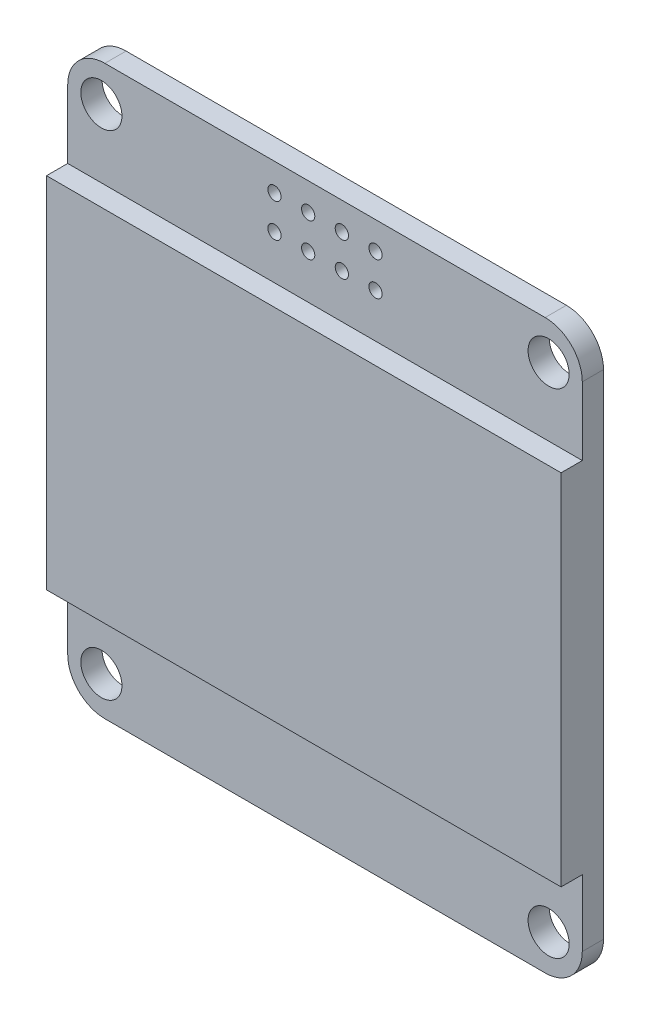
ISO-10303-21;
HEADER;
FILE_DESCRIPTION(('STEP AP214'),'2;1');
FILE_NAME('part.step','',(''),(''),'','','');
FILE_SCHEMA(('AUTOMOTIVE_DESIGN { 1 0 10303 214 1 1 1 1 }'));
ENDSEC;
DATA;
#1=APPLICATION_CONTEXT('core data for automotive mechanical design processes');
#2=APPLICATION_PROTOCOL_DEFINITION('international standard','automotive_design',2000,#1);
#3=PRODUCT_CONTEXT('',#1,'mechanical');
#4=PRODUCT('Part','Part','',(#3));
#5=PRODUCT_RELATED_PRODUCT_CATEGORY('part','',(#4));
#6=PRODUCT_DEFINITION_FORMATION('','',#4);
#7=PRODUCT_DEFINITION_CONTEXT('part definition',#1,'design');
#8=PRODUCT_DEFINITION('design','',#6,#7);
#9=PRODUCT_DEFINITION_SHAPE('','',#8);
#10=(LENGTH_UNIT() NAMED_UNIT(*) SI_UNIT(.MILLI.,.METRE.));
#11=(NAMED_UNIT(*) PLANE_ANGLE_UNIT() SI_UNIT($,.RADIAN.));
#12=(NAMED_UNIT(*) SI_UNIT($,.STERADIAN.) SOLID_ANGLE_UNIT());
#13=UNCERTAINTY_MEASURE_WITH_UNIT(LENGTH_MEASURE(1.E-05),#10,'distance_accuracy_value','');
#14=(GEOMETRIC_REPRESENTATION_CONTEXT(3) GLOBAL_UNCERTAINTY_ASSIGNED_CONTEXT((#13)) GLOBAL_UNIT_ASSIGNED_CONTEXT((#10,
#11,#12)) REPRESENTATION_CONTEXT('',''));
#15=CARTESIAN_POINT('',(0.,0.,0.));
#16=DIRECTION('',(0.,0.,1.));
#17=DIRECTION('',(1.,0.,0.));
#18=AXIS2_PLACEMENT_3D('',#15,#16,#17);
#19=CARTESIAN_POINT('',(16.6,18.6,0.));
#20=DIRECTION('',(0.,0.,1.));
#21=DIRECTION('',(1.,0.,0.));
#22=AXIS2_PLACEMENT_3D('',#19,#20,#21);
#23=PLANE('',#22);
#24=CARTESIAN_POINT('',(16.8616822429906,18.6,0.));
#25=DIRECTION('',(0.,0.,1.));
#26=DIRECTION('',(1.,0.,0.));
#27=AXIS2_PLACEMENT_3D('',#24,#25,#26);
#28=CIRCLE('',#27,1.55);
#29=CARTESIAN_POINT('',(18.4116822429906,18.6,0.));
#30=VERTEX_POINT('',#29);
#31=EDGE_CURVE('E255',#30,#30,#28,.T.);
#32=ORIENTED_EDGE('',*,*,#31,.T.);
#33=EDGE_LOOP('',(#32));
#34=FACE_BOUND('',#33,.T.);
#35=CARTESIAN_POINT('',(16.8616822429907,-18.6,0.));
#36=DIRECTION('',(0.,0.,1.));
#37=DIRECTION('',(1.,0.,0.));
#38=AXIS2_PLACEMENT_3D('',#35,#36,#37);
#39=CIRCLE('',#38,1.55);
#40=CARTESIAN_POINT('',(18.4116822429907,-18.6,0.));
#41=VERTEX_POINT('',#40);
#42=EDGE_CURVE('E261',#41,#41,#39,.T.);
#43=ORIENTED_EDGE('',*,*,#42,.T.);
#44=EDGE_LOOP('',(#43));
#45=FACE_BOUND('',#44,.T.);
#46=CARTESIAN_POINT('',(-16.8616822429907,-18.6,0.));
#47=DIRECTION('',(0.,0.,1.));
#48=DIRECTION('',(1.,0.,0.));
#49=AXIS2_PLACEMENT_3D('',#46,#47,#48);
#50=CIRCLE('',#49,1.55);
#51=CARTESIAN_POINT('',(-15.3116822429907,-18.6,0.));
#52=VERTEX_POINT('',#51);
#53=EDGE_CURVE('E267',#52,#52,#50,.T.);
#54=ORIENTED_EDGE('',*,*,#53,.T.);
#55=EDGE_LOOP('',(#54));
#56=FACE_BOUND('',#55,.T.);
#57=CARTESIAN_POINT('',(-16.8616822429907,18.6,0.));
#58=DIRECTION('',(0.,0.,1.));
#59=DIRECTION('',(1.,0.,0.));
#60=AXIS2_PLACEMENT_3D('',#57,#58,#59);
#61=CIRCLE('',#60,1.55);
#62=CARTESIAN_POINT('',(-15.3116822429907,18.6,0.));
#63=VERTEX_POINT('',#62);
#64=EDGE_CURVE('E273',#63,#63,#61,.T.);
#65=ORIENTED_EDGE('',*,*,#64,.T.);
#66=EDGE_LOOP('',(#65));
#67=FACE_BOUND('',#66,.T.);
#68=CARTESIAN_POINT('',(16.6,18.6,0.));
#69=DIRECTION('',(0.,0.,1.));
#70=DIRECTION('',(1.,0.,0.));
#71=AXIS2_PLACEMENT_3D('',#68,#69,#70);
#72=CIRCLE('',#71,2.8);
#73=CARTESIAN_POINT('',(19.4,18.6,0.));
#74=VERTEX_POINT('',#73);
#75=CARTESIAN_POINT('',(16.6,21.4,0.));
#76=VERTEX_POINT('',#75);
#77=EDGE_CURVE('E279',#74,#76,#72,.T.);
#78=ORIENTED_EDGE('',*,*,#77,.F.);
#79=DIRECTION('',(0.,1.,0.));
#80=VECTOR('',#79,1.);
#81=CARTESIAN_POINT('',(19.4,-18.6,0.));
#82=LINE('',#81,#80);
#83=CARTESIAN_POINT('',(19.4,-18.6,0.));
#84=VERTEX_POINT('',#83);
#85=EDGE_CURVE('E286',#84,#74,#82,.T.);
#86=ORIENTED_EDGE('',*,*,#85,.F.);
#87=CARTESIAN_POINT('',(16.6,-18.6,0.));
#88=DIRECTION('',(0.,0.,1.));
#89=DIRECTION('',(1.,0.,0.));
#90=AXIS2_PLACEMENT_3D('',#87,#88,#89);
#91=CIRCLE('',#90,2.8);
#92=CARTESIAN_POINT('',(16.6,-21.4,0.));
#93=VERTEX_POINT('',#92);
#94=EDGE_CURVE('E315',#93,#84,#91,.T.);
#95=ORIENTED_EDGE('',*,*,#94,.F.);
#96=DIRECTION('',(1.,0.,0.));
#97=VECTOR('',#96,1.);
#98=CARTESIAN_POINT('',(16.6,-21.4,0.));
#99=LINE('',#98,#97);
#100=CARTESIAN_POINT('',(-16.6,-21.4,0.));
#101=VERTEX_POINT('',#100);
#102=EDGE_CURVE('E313',#101,#93,#99,.T.);
#103=ORIENTED_EDGE('',*,*,#102,.F.);
#104=CARTESIAN_POINT('',(-16.6,-18.6,0.));
#105=DIRECTION('',(0.,0.,1.));
#106=DIRECTION('',(-1.,0.,0.));
#107=AXIS2_PLACEMENT_3D('',#104,#105,#106);
#108=CIRCLE('',#107,2.8);
#109=CARTESIAN_POINT('',(-19.4,-18.6,0.));
#110=VERTEX_POINT('',#109);
#111=EDGE_CURVE('E311',#110,#101,#108,.T.);
#112=ORIENTED_EDGE('',*,*,#111,.F.);
#113=DIRECTION('',(0.,-1.,0.));
#114=VECTOR('',#113,1.);
#115=CARTESIAN_POINT('',(-19.4,-18.6,0.));
#116=LINE('',#115,#114);
#117=CARTESIAN_POINT('',(-19.4,18.6,0.));
#118=VERTEX_POINT('',#117);
#119=EDGE_CURVE('E309',#118,#110,#116,.T.);
#120=ORIENTED_EDGE('',*,*,#119,.F.);
#121=CARTESIAN_POINT('',(-16.6,18.6,0.));
#122=DIRECTION('',(0.,0.,1.));
#123=DIRECTION('',(1.,0.,0.));
#124=AXIS2_PLACEMENT_3D('',#121,#122,#123);
#125=CIRCLE('',#124,2.8);
#126=CARTESIAN_POINT('',(-16.6,21.4,0.));
#127=VERTEX_POINT('',#126);
#128=EDGE_CURVE('E307',#127,#118,#125,.T.);
#129=ORIENTED_EDGE('',*,*,#128,.F.);
#130=DIRECTION('',(-1.,0.,0.));
#131=VECTOR('',#130,1.);
#132=CARTESIAN_POINT('',(16.6,21.4,0.));
#133=LINE('',#132,#131);
#134=EDGE_CURVE('E305',#76,#127,#133,.T.);
#135=ORIENTED_EDGE('',*,*,#134,.F.);
#136=EDGE_LOOP('',(#78,#86,#95,#103,#112,#120,#129,#135));
#137=FACE_BOUND('',#136,.T.);
#138=CARTESIAN_POINT('',(-3.81,16.7825061054046,0.));
#139=DIRECTION('',(0.,0.,1.));
#140=DIRECTION('',(1.,0.,0.));
#141=AXIS2_PLACEMENT_3D('',#138,#139,#140);
#142=CIRCLE('',#141,0.500000000000001);
#143=CARTESIAN_POINT('',(-3.31,16.7825061054046,0.));
#144=VERTEX_POINT('',#143);
#145=EDGE_CURVE('E252',#144,#144,#142,.T.);
#146=ORIENTED_EDGE('',*,*,#145,.T.);
#147=EDGE_LOOP('',(#146));
#148=FACE_BOUND('',#147,.T.);
#149=CARTESIAN_POINT('',(-3.81,19.3225061054046,0.));
#150=DIRECTION('',(0.,0.,1.));
#151=DIRECTION('',(1.,0.,0.));
#152=AXIS2_PLACEMENT_3D('',#149,#150,#151);
#153=CIRCLE('',#152,0.500000000000001);
#154=CARTESIAN_POINT('',(-3.31,19.3225061054046,0.));
#155=VERTEX_POINT('',#154);
#156=EDGE_CURVE('E209',#155,#155,#153,.T.);
#157=ORIENTED_EDGE('',*,*,#156,.T.);
#158=EDGE_LOOP('',(#157));
#159=FACE_BOUND('',#158,.T.);
#160=CARTESIAN_POINT('',(3.81,19.3225061054046,0.));
#161=DIRECTION('',(0.,0.,1.));
#162=DIRECTION('',(1.,0.,0.));
#163=AXIS2_PLACEMENT_3D('',#160,#161,#162);
#164=CIRCLE('',#163,0.500000000000002);
#165=CARTESIAN_POINT('',(4.31,19.3225061054046,0.));
#166=VERTEX_POINT('',#165);
#167=EDGE_CURVE('E220',#166,#166,#164,.T.);
#168=ORIENTED_EDGE('',*,*,#167,.T.);
#169=EDGE_LOOP('',(#168));
#170=FACE_BOUND('',#169,.T.);
#171=CARTESIAN_POINT('',(1.27,19.3225061054046,0.));
#172=DIRECTION('',(0.,0.,1.));
#173=DIRECTION('',(1.,0.,0.));
#174=AXIS2_PLACEMENT_3D('',#171,#172,#173);
#175=CIRCLE('',#174,0.500000000000001);
#176=CARTESIAN_POINT('',(1.77,19.3225061054046,0.));
#177=VERTEX_POINT('',#176);
#178=EDGE_CURVE('E214',#177,#177,#175,.T.);
#179=ORIENTED_EDGE('',*,*,#178,.T.);
#180=EDGE_LOOP('',(#179));
#181=FACE_BOUND('',#180,.T.);
#182=CARTESIAN_POINT('',(-1.27,16.7825061054046,0.));
#183=DIRECTION('',(0.,0.,1.));
#184=DIRECTION('',(1.,0.,0.));
#185=AXIS2_PLACEMENT_3D('',#182,#183,#184);
#186=CIRCLE('',#185,0.500000000000001);
#187=CARTESIAN_POINT('',(-0.769999999999998,16.7825061054046,0.));
#188=VERTEX_POINT('',#187);
#189=EDGE_CURVE('E244',#188,#188,#186,.T.);
#190=ORIENTED_EDGE('',*,*,#189,.T.);
#191=EDGE_LOOP('',(#190));
#192=FACE_BOUND('',#191,.T.);
#193=CARTESIAN_POINT('',(1.27,16.7825061054046,0.));
#194=DIRECTION('',(0.,0.,1.));
#195=DIRECTION('',(1.,0.,0.));
#196=AXIS2_PLACEMENT_3D('',#193,#194,#195);
#197=CIRCLE('',#196,0.500000000000001);
#198=CARTESIAN_POINT('',(1.77,16.7825061054046,0.));
#199=VERTEX_POINT('',#198);
#200=EDGE_CURVE('E231',#199,#199,#197,.T.);
#201=ORIENTED_EDGE('',*,*,#200,.T.);
#202=EDGE_LOOP('',(#201));
#203=FACE_BOUND('',#202,.T.);
#204=CARTESIAN_POINT('',(3.81,16.7825061054046,0.));
#205=DIRECTION('',(0.,0.,1.));
#206=DIRECTION('',(1.,0.,0.));
#207=AXIS2_PLACEMENT_3D('',#204,#205,#206);
#208=CIRCLE('',#207,0.500000000000002);
#209=CARTESIAN_POINT('',(4.31,16.7825061054046,0.));
#210=VERTEX_POINT('',#209);
#211=EDGE_CURVE('E232',#210,#210,#208,.T.);
#212=ORIENTED_EDGE('',*,*,#211,.T.);
#213=EDGE_LOOP('',(#212));
#214=FACE_BOUND('',#213,.T.);
#215=CARTESIAN_POINT('',(-1.27,19.3225061054046,0.));
#216=DIRECTION('',(0.,0.,1.));
#217=DIRECTION('',(1.,0.,0.));
#218=AXIS2_PLACEMENT_3D('',#215,#216,#217);
#219=CIRCLE('',#218,0.500000000000001);
#220=CARTESIAN_POINT('',(-0.769999999999999,19.3225061054046,0.));
#221=VERTEX_POINT('',#220);
#222=EDGE_CURVE('E213',#221,#221,#219,.T.);
#223=ORIENTED_EDGE('',*,*,#222,.T.);
#224=EDGE_LOOP('',(#223));
#225=FACE_BOUND('',#224,.T.);
#226=DIRECTION('',(0.,-1.,0.));
#227=VECTOR('',#226,1.);
#228=CARTESIAN_POINT('',(-8.36974635686231,7.63662988764811,0.));
#229=LINE('',#228,#227);
#230=CARTESIAN_POINT('',(-8.36974635686231,7.63662988764811,0.));
#231=VERTEX_POINT('',#230);
#232=CARTESIAN_POINT('',(-8.36974635686232,-6.37404041289027,0.));
#233=VERTEX_POINT('',#232);
#234=EDGE_CURVE('E176',#231,#233,#229,.T.);
#235=ORIENTED_EDGE('',*,*,#234,.F.);
#236=DIRECTION('',(1.,0.,0.));
#237=VECTOR('',#236,1.);
#238=CARTESIAN_POINT('',(-8.36974635686231,7.63662988764811,0.));
#239=LINE('',#238,#237);
#240=CARTESIAN_POINT('',(-12.238972166604,7.63662988764811,0.));
#241=VERTEX_POINT('',#240);
#242=EDGE_CURVE('E173',#241,#231,#239,.T.);
#243=ORIENTED_EDGE('',*,*,#242,.F.);
#244=DIRECTION('',(0.,1.,0.));
#245=VECTOR('',#244,1.);
#246=CARTESIAN_POINT('',(-12.238972166604,7.63662988764811,0.));
#247=LINE('',#246,#245);
#248=CARTESIAN_POINT('',(-12.238972166604,-6.37404041289026,0.));
#249=VERTEX_POINT('',#248);
#250=EDGE_CURVE('E63',#249,#241,#247,.T.);
#251=ORIENTED_EDGE('',*,*,#250,.F.);
#252=DIRECTION('',(-1.,0.,0.));
#253=VECTOR('',#252,1.);
#254=CARTESIAN_POINT('',(-8.36974635686231,-6.37404041289026,0.));
#255=LINE('',#254,#253);
#256=EDGE_CURVE('E58',#233,#249,#255,.T.);
#257=ORIENTED_EDGE('',*,*,#256,.F.);
#258=EDGE_LOOP('',(#235,#243,#251,#257));
#259=FACE_BOUND('',#258,.T.);
#260=ADVANCED_FACE('F43',(#34,#45,#56,#67,#137,#148,#159,#170,#181,#192,#203,#214,#225,#259),
#23,.F.);
#261=CARTESIAN_POINT('',(16.6,18.6,1.6));
#262=DIRECTION('',(0.,0.,1.));
#263=DIRECTION('',(1.,0.,0.));
#264=AXIS2_PLACEMENT_3D('',#261,#262,#263);
#265=PLANE('',#264);
#266=DIRECTION('',(-1.,0.,0.));
#267=VECTOR('',#266,1.);
#268=CARTESIAN_POINT('',(-19.4,13.4608329486277,1.6));
#269=LINE('',#268,#267);
#270=CARTESIAN_POINT('',(19.4,13.4608329486277,1.6));
#271=VERTEX_POINT('',#270);
#272=CARTESIAN_POINT('',(-19.4,13.4608329486277,1.6));
#273=VERTEX_POINT('',#272);
#274=EDGE_CURVE('E180',#271,#273,#269,.T.);
#275=ORIENTED_EDGE('',*,*,#274,.F.);
#276=DIRECTION('',(0.,1.,0.));
#277=VECTOR('',#276,1.);
#278=CARTESIAN_POINT('',(19.4,-18.6,1.6));
#279=LINE('',#278,#277);
#280=CARTESIAN_POINT('',(19.4,18.6,1.6));
#281=VERTEX_POINT('',#280);
#282=EDGE_CURVE('E299',#271,#281,#279,.T.);
#283=ORIENTED_EDGE('',*,*,#282,.T.);
#284=CARTESIAN_POINT('',(16.6,18.6,1.6));
#285=DIRECTION('',(0.,0.,1.));
#286=DIRECTION('',(1.,0.,0.));
#287=AXIS2_PLACEMENT_3D('',#284,#285,#286);
#288=CIRCLE('',#287,2.8);
#289=CARTESIAN_POINT('',(16.6,21.4,1.6));
#290=VERTEX_POINT('',#289);
#291=EDGE_CURVE('E282',#281,#290,#288,.T.);
#292=ORIENTED_EDGE('',*,*,#291,.T.);
#293=DIRECTION('',(-1.,0.,0.));
#294=VECTOR('',#293,1.);
#295=CARTESIAN_POINT('',(16.6,21.4,1.6));
#296=LINE('',#295,#294);
#297=CARTESIAN_POINT('',(-16.6,21.4,1.6));
#298=VERTEX_POINT('',#297);
#299=EDGE_CURVE('E285',#290,#298,#296,.T.);
#300=ORIENTED_EDGE('',*,*,#299,.T.);
#301=CARTESIAN_POINT('',(-16.6,18.6,1.6));
#302=DIRECTION('',(0.,0.,1.));
#303=DIRECTION('',(1.,0.,0.));
#304=AXIS2_PLACEMENT_3D('',#301,#302,#303);
#305=CIRCLE('',#304,2.8);
#306=CARTESIAN_POINT('',(-19.4,18.6,1.6));
#307=VERTEX_POINT('',#306);
#308=EDGE_CURVE('E288',#298,#307,#305,.T.);
#309=ORIENTED_EDGE('',*,*,#308,.T.);
#310=DIRECTION('',(0.,-1.,0.));
#311=VECTOR('',#310,1.);
#312=CARTESIAN_POINT('',(-19.4,-18.6,1.6));
#313=LINE('',#312,#311);
#314=EDGE_CURVE('E291',#307,#273,#313,.T.);
#315=ORIENTED_EDGE('',*,*,#314,.T.);
#316=EDGE_LOOP('',(#275,#283,#292,#300,#309,#315));
#317=FACE_BOUND('',#316,.T.);
#318=CARTESIAN_POINT('',(16.8616822429906,18.6,1.6));
#319=DIRECTION('',(0.,0.,1.));
#320=DIRECTION('',(1.,0.,0.));
#321=AXIS2_PLACEMENT_3D('',#318,#319,#320);
#322=CIRCLE('',#321,1.55);
#323=CARTESIAN_POINT('',(18.4116822429906,18.6,1.6));
#324=VERTEX_POINT('',#323);
#325=EDGE_CURVE('E258',#324,#324,#322,.T.);
#326=ORIENTED_EDGE('',*,*,#325,.F.);
#327=EDGE_LOOP('',(#326));
#328=FACE_BOUND('',#327,.T.);
#329=CARTESIAN_POINT('',(-16.8616822429907,18.6,1.6));
#330=DIRECTION('',(0.,0.,1.));
#331=DIRECTION('',(1.,0.,0.));
#332=AXIS2_PLACEMENT_3D('',#329,#330,#331);
#333=CIRCLE('',#332,1.55);
#334=CARTESIAN_POINT('',(-15.3116822429907,18.6,1.6));
#335=VERTEX_POINT('',#334);
#336=EDGE_CURVE('E276',#335,#335,#333,.T.);
#337=ORIENTED_EDGE('',*,*,#336,.F.);
#338=EDGE_LOOP('',(#337));
#339=FACE_BOUND('',#338,.T.);
#340=CARTESIAN_POINT('',(-3.81,16.7825061054046,1.6));
#341=DIRECTION('',(0.,0.,1.));
#342=DIRECTION('',(1.,0.,0.));
#343=AXIS2_PLACEMENT_3D('',#340,#341,#342);
#344=CIRCLE('',#343,0.500000000000001);
#345=CARTESIAN_POINT('',(-3.31,16.7825061054046,1.6));
#346=VERTEX_POINT('',#345);
#347=EDGE_CURVE('E243',#346,#346,#344,.T.);
#348=ORIENTED_EDGE('',*,*,#347,.F.);
#349=EDGE_LOOP('',(#348));
#350=FACE_BOUND('',#349,.T.);
#351=CARTESIAN_POINT('',(-3.81,19.3225061054046,1.6));
#352=DIRECTION('',(0.,0.,1.));
#353=DIRECTION('',(1.,0.,0.));
#354=AXIS2_PLACEMENT_3D('',#351,#352,#353);
#355=CIRCLE('',#354,0.500000000000001);
#356=CARTESIAN_POINT('',(-3.31,19.3225061054046,1.6));
#357=VERTEX_POINT('',#356);
#358=EDGE_CURVE('E223',#357,#357,#355,.T.);
#359=ORIENTED_EDGE('',*,*,#358,.F.);
#360=EDGE_LOOP('',(#359));
#361=FACE_BOUND('',#360,.T.);
#362=CARTESIAN_POINT('',(3.81,19.3225061054046,1.6));
#363=DIRECTION('',(0.,0.,1.));
#364=DIRECTION('',(1.,0.,0.));
#365=AXIS2_PLACEMENT_3D('',#362,#363,#364);
#366=CIRCLE('',#365,0.500000000000002);
#367=CARTESIAN_POINT('',(4.31,19.3225061054046,1.6));
#368=VERTEX_POINT('',#367);
#369=EDGE_CURVE('E217',#368,#368,#366,.T.);
#370=ORIENTED_EDGE('',*,*,#369,.F.);
#371=EDGE_LOOP('',(#370));
#372=FACE_BOUND('',#371,.T.);
#373=CARTESIAN_POINT('',(1.27,19.3225061054046,1.6));
#374=DIRECTION('',(0.,0.,1.));
#375=DIRECTION('',(1.,0.,0.));
#376=AXIS2_PLACEMENT_3D('',#373,#374,#375);
#377=CIRCLE('',#376,0.500000000000001);
#378=CARTESIAN_POINT('',(1.77,19.3225061054046,1.6));
#379=VERTEX_POINT('',#378);
#380=EDGE_CURVE('E210',#379,#379,#377,.T.);
#381=ORIENTED_EDGE('',*,*,#380,.F.);
#382=EDGE_LOOP('',(#381));
#383=FACE_BOUND('',#382,.T.);
#384=CARTESIAN_POINT('',(-1.27,16.7825061054046,1.6));
#385=DIRECTION('',(0.,0.,1.));
#386=DIRECTION('',(1.,0.,0.));
#387=AXIS2_PLACEMENT_3D('',#384,#385,#386);
#388=CIRCLE('',#387,0.500000000000001);
#389=CARTESIAN_POINT('',(-0.769999999999998,16.7825061054046,1.6));
#390=VERTEX_POINT('',#389);
#391=EDGE_CURVE('E240',#390,#390,#388,.T.);
#392=ORIENTED_EDGE('',*,*,#391,.F.);
#393=EDGE_LOOP('',(#392));
#394=FACE_BOUND('',#393,.T.);
#395=CARTESIAN_POINT('',(1.27,16.7825061054046,1.6));
#396=DIRECTION('',(0.,0.,1.));
#397=DIRECTION('',(1.,0.,0.));
#398=AXIS2_PLACEMENT_3D('',#395,#396,#397);
#399=CIRCLE('',#398,0.500000000000001);
#400=CARTESIAN_POINT('',(1.77,16.7825061054046,1.6));
#401=VERTEX_POINT('',#400);
#402=EDGE_CURVE('E247',#401,#401,#399,.T.);
#403=ORIENTED_EDGE('',*,*,#402,.F.);
#404=EDGE_LOOP('',(#403));
#405=FACE_BOUND('',#404,.T.);
#406=CARTESIAN_POINT('',(3.81,16.7825061054046,1.6));
#407=DIRECTION('',(0.,0.,1.));
#408=DIRECTION('',(1.,0.,0.));
#409=AXIS2_PLACEMENT_3D('',#406,#407,#408);
#410=CIRCLE('',#409,0.500000000000002);
#411=CARTESIAN_POINT('',(4.31,16.7825061054046,1.6));
#412=VERTEX_POINT('',#411);
#413=EDGE_CURVE('E228',#412,#412,#410,.T.);
#414=ORIENTED_EDGE('',*,*,#413,.F.);
#415=EDGE_LOOP('',(#414));
#416=FACE_BOUND('',#415,.T.);
#417=CARTESIAN_POINT('',(-1.27,19.3225061054046,1.6));
#418=DIRECTION('',(0.,0.,1.));
#419=DIRECTION('',(1.,0.,0.));
#420=AXIS2_PLACEMENT_3D('',#417,#418,#419);
#421=CIRCLE('',#420,0.500000000000001);
#422=CARTESIAN_POINT('',(-0.769999999999999,19.3225061054046,1.6));
#423=VERTEX_POINT('',#422);
#424=EDGE_CURVE('E235',#423,#423,#421,.T.);
#425=ORIENTED_EDGE('',*,*,#424,.F.);
#426=EDGE_LOOP('',(#425));
#427=FACE_BOUND('',#426,.T.);
#428=ADVANCED_FACE('F377',(#317,#328,#339,#350,#361,#372,#383,#394,#405,#416,#427),#265,.T.);
#429=DIRECTION('',(1.,0.,0.));
#430=VECTOR('',#429,1.);
#431=CARTESIAN_POINT('',(-19.4,-13.5830190268301,1.6));
#432=LINE('',#431,#430);
#433=CARTESIAN_POINT('',(-19.4,-13.5830190268301,1.6));
#434=VERTEX_POINT('',#433);
#435=CARTESIAN_POINT('',(19.4,-13.5830190268301,1.6));
#436=VERTEX_POINT('',#435);
#437=EDGE_CURVE('E177',#434,#436,#432,.T.);
#438=ORIENTED_EDGE('',*,*,#437,.F.);
#439=CARTESIAN_POINT('',(-19.4,-18.6,1.6));
#440=VERTEX_POINT('',#439);
#441=EDGE_CURVE('E290',#434,#440,#313,.T.);
#442=ORIENTED_EDGE('',*,*,#441,.T.);
#443=CARTESIAN_POINT('',(-16.6,-18.6,1.6));
#444=DIRECTION('',(0.,0.,1.));
#445=DIRECTION('',(-1.,0.,0.));
#446=AXIS2_PLACEMENT_3D('',#443,#444,#445);
#447=CIRCLE('',#446,2.8);
#448=CARTESIAN_POINT('',(-16.6,-21.4,1.6));
#449=VERTEX_POINT('',#448);
#450=EDGE_CURVE('E293',#440,#449,#447,.T.);
#451=ORIENTED_EDGE('',*,*,#450,.T.);
#452=DIRECTION('',(1.,0.,0.));
#453=VECTOR('',#452,1.);
#454=CARTESIAN_POINT('',(16.6,-21.4,1.6));
#455=LINE('',#454,#453);
#456=CARTESIAN_POINT('',(16.6,-21.4,1.6));
#457=VERTEX_POINT('',#456);
#458=EDGE_CURVE('E295',#449,#457,#455,.T.);
#459=ORIENTED_EDGE('',*,*,#458,.T.);
#460=CARTESIAN_POINT('',(16.6,-18.6,1.6));
#461=DIRECTION('',(0.,0.,1.));
#462=DIRECTION('',(1.,0.,0.));
#463=AXIS2_PLACEMENT_3D('',#460,#461,#462);
#464=CIRCLE('',#463,2.8);
#465=CARTESIAN_POINT('',(19.4,-18.6,1.6));
#466=VERTEX_POINT('',#465);
#467=EDGE_CURVE('E297',#457,#466,#464,.T.);
#468=ORIENTED_EDGE('',*,*,#467,.T.);
#469=EDGE_CURVE('E300',#466,#436,#279,.T.);
#470=ORIENTED_EDGE('',*,*,#469,.T.);
#471=EDGE_LOOP('',(#438,#442,#451,#459,#468,#470));
#472=FACE_BOUND('',#471,.T.);
#473=CARTESIAN_POINT('',(16.8616822429907,-18.6,1.6));
#474=DIRECTION('',(0.,0.,1.));
#475=DIRECTION('',(1.,0.,0.));
#476=AXIS2_PLACEMENT_3D('',#473,#474,#475);
#477=CIRCLE('',#476,1.55);
#478=CARTESIAN_POINT('',(18.4116822429907,-18.6,1.6));
#479=VERTEX_POINT('',#478);
#480=EDGE_CURVE('E264',#479,#479,#477,.T.);
#481=ORIENTED_EDGE('',*,*,#480,.F.);
#482=EDGE_LOOP('',(#481));
#483=FACE_BOUND('',#482,.T.);
#484=CARTESIAN_POINT('',(-16.8616822429907,-18.6,1.6));
#485=DIRECTION('',(0.,0.,1.));
#486=DIRECTION('',(1.,0.,0.));
#487=AXIS2_PLACEMENT_3D('',#484,#485,#486);
#488=CIRCLE('',#487,1.55);
#489=CARTESIAN_POINT('',(-15.3116822429907,-18.6,1.6));
#490=VERTEX_POINT('',#489);
#491=EDGE_CURVE('E270',#490,#490,#488,.T.);
#492=ORIENTED_EDGE('',*,*,#491,.F.);
#493=EDGE_LOOP('',(#492));
#494=FACE_BOUND('',#493,.T.);
#495=ADVANCED_FACE('F359',(#472,#483,#494),#265,.T.);
#496=CARTESIAN_POINT('',(16.6,18.6,1.6));
#497=DIRECTION('',(0.,0.,-1.));
#498=DIRECTION('',(-1.,0.,0.));
#499=AXIS2_PLACEMENT_3D('',#496,#497,#498);
#500=CYLINDRICAL_SURFACE('',#499,2.8);
#501=ORIENTED_EDGE('',*,*,#77,.T.);
#502=DIRECTION('',(0.,0.,-1.));
#503=VECTOR('',#502,1.);
#504=CARTESIAN_POINT('',(16.6,21.4,1.6));
#505=LINE('',#504,#503);
#506=EDGE_CURVE('E11',#290,#76,#505,.T.);
#507=ORIENTED_EDGE('',*,*,#506,.F.);
#508=ORIENTED_EDGE('',*,*,#291,.F.);
#509=DIRECTION('',(0.,0.,-1.));
#510=VECTOR('',#509,1.);
#511=CARTESIAN_POINT('',(19.4,18.6,1.6));
#512=LINE('',#511,#510);
#513=EDGE_CURVE('E302',#281,#74,#512,.T.);
#514=ORIENTED_EDGE('',*,*,#513,.T.);
#515=EDGE_LOOP('',(#501,#507,#508,#514));
#516=FACE_BOUND('',#515,.T.);
#517=ADVANCED_FACE('F45',(#516),#500,.T.);
#518=CARTESIAN_POINT('',(16.6,21.4,1.6));
#519=DIRECTION('',(0.,-1.,0.));
#520=DIRECTION('',(1.,0.,0.));
#521=AXIS2_PLACEMENT_3D('',#518,#519,#520);
#522=PLANE('',#521);
#523=ORIENTED_EDGE('',*,*,#134,.T.);
#524=DIRECTION('',(0.,0.,-1.));
#525=VECTOR('',#524,1.);
#526=CARTESIAN_POINT('',(-16.6,21.4,1.6));
#527=LINE('',#526,#525);
#528=EDGE_CURVE('E51',#298,#127,#527,.T.);
#529=ORIENTED_EDGE('',*,*,#528,.F.);
#530=ORIENTED_EDGE('',*,*,#299,.F.);
#531=ORIENTED_EDGE('',*,*,#506,.T.);
#532=EDGE_LOOP('',(#523,#529,#530,#531));
#533=FACE_BOUND('',#532,.T.);
#534=ADVANCED_FACE('F386',(#533),#522,.F.);
#535=CARTESIAN_POINT('',(-16.6,18.6,1.6));
#536=DIRECTION('',(0.,0.,-1.));
#537=DIRECTION('',(-1.,0.,0.));
#538=AXIS2_PLACEMENT_3D('',#535,#536,#537);
#539=CYLINDRICAL_SURFACE('',#538,2.8);
#540=ORIENTED_EDGE('',*,*,#128,.T.);
#541=DIRECTION('',(0.,0.,-1.));
#542=VECTOR('',#541,1.);
#543=CARTESIAN_POINT('',(-19.4,18.6,1.6));
#544=LINE('',#543,#542);
#545=EDGE_CURVE('E332',#307,#118,#544,.T.);
#546=ORIENTED_EDGE('',*,*,#545,.F.);
#547=ORIENTED_EDGE('',*,*,#308,.F.);
#548=ORIENTED_EDGE('',*,*,#528,.T.);
#549=EDGE_LOOP('',(#540,#546,#547,#548));
#550=FACE_BOUND('',#549,.T.);
#551=ADVANCED_FACE('F339',(#550),#539,.T.);
#552=CARTESIAN_POINT('',(-19.4,-18.6,1.6));
#553=DIRECTION('',(1.,0.,0.));
#554=DIRECTION('',(0.,0.,-1.));
#555=AXIS2_PLACEMENT_3D('',#552,#553,#554);
#556=PLANE('',#555);
#557=ORIENTED_EDGE('',*,*,#119,.T.);
#558=DIRECTION('',(0.,0.,-1.));
#559=VECTOR('',#558,1.);
#560=CARTESIAN_POINT('',(-19.4,-18.6,1.6));
#561=LINE('',#560,#559);
#562=EDGE_CURVE('E329',#440,#110,#561,.T.);
#563=ORIENTED_EDGE('',*,*,#562,.F.);
#564=ORIENTED_EDGE('',*,*,#441,.F.);
#565=DIRECTION('',(0.,0.,-1.));
#566=VECTOR('',#565,1.);
#567=CARTESIAN_POINT('',(-19.4,-13.5830190268301,3.2));
#568=LINE('',#567,#566);
#569=CARTESIAN_POINT('',(-19.4,-13.5830190268301,3.2));
#570=VERTEX_POINT('',#569);
#571=EDGE_CURVE('E206',#570,#434,#568,.T.);
#572=ORIENTED_EDGE('',*,*,#571,.F.);
#573=DIRECTION('',(0.,-1.,0.));
#574=VECTOR('',#573,1.);
#575=CARTESIAN_POINT('',(-19.4,13.4608329486277,3.2));
#576=LINE('',#575,#574);
#577=CARTESIAN_POINT('',(-19.4,13.4608329486277,3.2));
#578=VERTEX_POINT('',#577);
#579=EDGE_CURVE('E186',#578,#570,#576,.T.);
#580=ORIENTED_EDGE('',*,*,#579,.F.);
#581=DIRECTION('',(0.,0.,-1.));
#582=VECTOR('',#581,1.);
#583=CARTESIAN_POINT('',(-19.4,13.4608329486277,3.2));
#584=LINE('',#583,#582);
#585=EDGE_CURVE('E194',#578,#273,#584,.T.);
#586=ORIENTED_EDGE('',*,*,#585,.T.);
#587=ORIENTED_EDGE('',*,*,#314,.F.);
#588=ORIENTED_EDGE('',*,*,#545,.T.);
#589=EDGE_LOOP('',(#557,#563,#564,#572,#580,#586,#587,#588));
#590=FACE_BOUND('',#589,.T.);
#591=ADVANCED_FACE('F350',(#590),#556,.F.);
#592=CARTESIAN_POINT('',(-16.6,-18.6,1.6));
#593=DIRECTION('',(0.,0.,-1.));
#594=DIRECTION('',(-1.,0.,0.));
#595=AXIS2_PLACEMENT_3D('',#592,#593,#594);
#596=CYLINDRICAL_SURFACE('',#595,2.8);
#597=ORIENTED_EDGE('',*,*,#111,.T.);
#598=DIRECTION('',(0.,0.,-1.));
#599=VECTOR('',#598,1.);
#600=CARTESIAN_POINT('',(-16.6,-21.4,1.6));
#601=LINE('',#600,#599);
#602=EDGE_CURVE('E326',#449,#101,#601,.T.);
#603=ORIENTED_EDGE('',*,*,#602,.F.);
#604=ORIENTED_EDGE('',*,*,#450,.F.);
#605=ORIENTED_EDGE('',*,*,#562,.T.);
#606=EDGE_LOOP('',(#597,#603,#604,#605));
#607=FACE_BOUND('',#606,.T.);
#608=ADVANCED_FACE('F355',(#607),#596,.T.);
#609=CARTESIAN_POINT('',(16.6,-21.4,1.6));
#610=DIRECTION('',(0.,1.,0.));
#611=DIRECTION('',(-1.,0.,0.));
#612=AXIS2_PLACEMENT_3D('',#609,#610,#611);
#613=PLANE('',#612);
#614=ORIENTED_EDGE('',*,*,#102,.T.);
#615=DIRECTION('',(0.,0.,-1.));
#616=VECTOR('',#615,1.);
#617=CARTESIAN_POINT('',(16.6,-21.4,1.6));
#618=LINE('',#617,#616);
#619=EDGE_CURVE('E323',#457,#93,#618,.T.);
#620=ORIENTED_EDGE('',*,*,#619,.F.);
#621=ORIENTED_EDGE('',*,*,#458,.F.);
#622=ORIENTED_EDGE('',*,*,#602,.T.);
#623=EDGE_LOOP('',(#614,#620,#621,#622));
#624=FACE_BOUND('',#623,.T.);
#625=ADVANCED_FACE('F394',(#624),#613,.F.);
#626=CARTESIAN_POINT('',(16.6,-18.6,1.6));
#627=DIRECTION('',(0.,0.,-1.));
#628=DIRECTION('',(-1.,0.,0.));
#629=AXIS2_PLACEMENT_3D('',#626,#627,#628);
#630=CYLINDRICAL_SURFACE('',#629,2.8);
#631=ORIENTED_EDGE('',*,*,#94,.T.);
#632=DIRECTION('',(0.,0.,-1.));
#633=VECTOR('',#632,1.);
#634=CARTESIAN_POINT('',(19.4,-18.6,1.6));
#635=LINE('',#634,#633);
#636=EDGE_CURVE('E320',#466,#84,#635,.T.);
#637=ORIENTED_EDGE('',*,*,#636,.F.);
#638=ORIENTED_EDGE('',*,*,#467,.F.);
#639=ORIENTED_EDGE('',*,*,#619,.T.);
#640=EDGE_LOOP('',(#631,#637,#638,#639));
#641=FACE_BOUND('',#640,.T.);
#642=ADVANCED_FACE('F390',(#641),#630,.T.);
#643=CARTESIAN_POINT('',(19.4,-18.6,1.6));
#644=DIRECTION('',(-1.,0.,0.));
#645=DIRECTION('',(0.,0.,1.));
#646=AXIS2_PLACEMENT_3D('',#643,#644,#645);
#647=PLANE('',#646);
#648=ORIENTED_EDGE('',*,*,#85,.T.);
#649=ORIENTED_EDGE('',*,*,#513,.F.);
#650=ORIENTED_EDGE('',*,*,#282,.F.);
#651=DIRECTION('',(0.,0.,-1.));
#652=VECTOR('',#651,1.);
#653=CARTESIAN_POINT('',(19.4,13.4608329486277,3.2));
#654=LINE('',#653,#652);
#655=CARTESIAN_POINT('',(19.4,13.4608329486277,3.2));
#656=VERTEX_POINT('',#655);
#657=EDGE_CURVE('E200',#656,#271,#654,.T.);
#658=ORIENTED_EDGE('',*,*,#657,.F.);
#659=DIRECTION('',(0.,1.,0.));
#660=VECTOR('',#659,1.);
#661=CARTESIAN_POINT('',(19.4,13.4608329486277,3.2));
#662=LINE('',#661,#660);
#663=CARTESIAN_POINT('',(19.4,-13.5830190268301,3.2));
#664=VERTEX_POINT('',#663);
#665=EDGE_CURVE('E191',#664,#656,#662,.T.);
#666=ORIENTED_EDGE('',*,*,#665,.F.);
#667=DIRECTION('',(0.,0.,-1.));
#668=VECTOR('',#667,1.);
#669=CARTESIAN_POINT('',(19.4,-13.5830190268301,3.2));
#670=LINE('',#669,#668);
#671=EDGE_CURVE('E203',#664,#436,#670,.T.);
#672=ORIENTED_EDGE('',*,*,#671,.T.);
#673=ORIENTED_EDGE('',*,*,#469,.F.);
#674=ORIENTED_EDGE('',*,*,#636,.T.);
#675=EDGE_LOOP('',(#648,#649,#650,#658,#666,#672,#673,#674));
#676=FACE_BOUND('',#675,.T.);
#677=ADVANCED_FACE('F381',(#676),#647,.F.);
#678=CARTESIAN_POINT('',(-16.8616822429907,18.6,1.6));
#679=DIRECTION('',(0.,0.,-1.));
#680=DIRECTION('',(-1.,0.,0.));
#681=AXIS2_PLACEMENT_3D('',#678,#679,#680);
#682=CYLINDRICAL_SURFACE('',#681,1.55);
#683=ORIENTED_EDGE('',*,*,#336,.T.);
#684=EDGE_LOOP('',(#683));
#685=FACE_BOUND('',#684,.T.);
#686=ORIENTED_EDGE('',*,*,#64,.F.);
#687=EDGE_LOOP('',(#686));
#688=FACE_BOUND('',#687,.T.);
#689=ADVANCED_FACE('F416',(#685,#688),#682,.F.);
#690=CARTESIAN_POINT('',(-16.8616822429907,-18.6,1.6));
#691=DIRECTION('',(0.,0.,-1.));
#692=DIRECTION('',(-1.,0.,0.));
#693=AXIS2_PLACEMENT_3D('',#690,#691,#692);
#694=CYLINDRICAL_SURFACE('',#693,1.55);
#695=ORIENTED_EDGE('',*,*,#491,.T.);
#696=EDGE_LOOP('',(#695));
#697=FACE_BOUND('',#696,.T.);
#698=ORIENTED_EDGE('',*,*,#53,.F.);
#699=EDGE_LOOP('',(#698));
#700=FACE_BOUND('',#699,.T.);
#701=ADVANCED_FACE('F420',(#697,#700),#694,.F.);
#702=CARTESIAN_POINT('',(16.8616822429907,-18.6,1.6));
#703=DIRECTION('',(0.,0.,-1.));
#704=DIRECTION('',(-1.,0.,0.));
#705=AXIS2_PLACEMENT_3D('',#702,#703,#704);
#706=CYLINDRICAL_SURFACE('',#705,1.55);
#707=ORIENTED_EDGE('',*,*,#480,.T.);
#708=EDGE_LOOP('',(#707));
#709=FACE_BOUND('',#708,.T.);
#710=ORIENTED_EDGE('',*,*,#42,.F.);
#711=EDGE_LOOP('',(#710));
#712=FACE_BOUND('',#711,.T.);
#713=ADVANCED_FACE('F425',(#709,#712),#706,.F.);
#714=CARTESIAN_POINT('',(16.8616822429906,18.6,1.6));
#715=DIRECTION('',(0.,0.,-1.));
#716=DIRECTION('',(-1.,0.,0.));
#717=AXIS2_PLACEMENT_3D('',#714,#715,#716);
#718=CYLINDRICAL_SURFACE('',#717,1.55);
#719=ORIENTED_EDGE('',*,*,#325,.T.);
#720=EDGE_LOOP('',(#719));
#721=FACE_BOUND('',#720,.T.);
#722=ORIENTED_EDGE('',*,*,#31,.F.);
#723=EDGE_LOOP('',(#722));
#724=FACE_BOUND('',#723,.T.);
#725=ADVANCED_FACE('F432',(#721,#724),#718,.F.);
#726=CARTESIAN_POINT('',(-3.81,16.7825061054046,0.));
#727=DIRECTION('',(0.,0.,1.));
#728=DIRECTION('',(1.,0.,0.));
#729=AXIS2_PLACEMENT_3D('',#726,#727,#728);
#730=CYLINDRICAL_SURFACE('',#729,0.500000000000001);
#731=ORIENTED_EDGE('',*,*,#145,.F.);
#732=EDGE_LOOP('',(#731));
#733=FACE_BOUND('',#732,.T.);
#734=ORIENTED_EDGE('',*,*,#347,.T.);
#735=EDGE_LOOP('',(#734));
#736=FACE_BOUND('',#735,.T.);
#737=ADVANCED_FACE('F436',(#733,#736),#730,.F.);
#738=CARTESIAN_POINT('',(-3.81,19.3225061054046,0.));
#739=DIRECTION('',(0.,0.,1.));
#740=DIRECTION('',(1.,0.,0.));
#741=AXIS2_PLACEMENT_3D('',#738,#739,#740);
#742=CYLINDRICAL_SURFACE('',#741,0.500000000000001);
#743=ORIENTED_EDGE('',*,*,#156,.F.);
#744=EDGE_LOOP('',(#743));
#745=FACE_BOUND('',#744,.T.);
#746=ORIENTED_EDGE('',*,*,#358,.T.);
#747=EDGE_LOOP('',(#746));
#748=FACE_BOUND('',#747,.T.);
#749=ADVANCED_FACE('F440',(#745,#748),#742,.F.);
#750=CARTESIAN_POINT('',(3.81,19.3225061054046,0.));
#751=DIRECTION('',(0.,0.,1.));
#752=DIRECTION('',(1.,0.,0.));
#753=AXIS2_PLACEMENT_3D('',#750,#751,#752);
#754=CYLINDRICAL_SURFACE('',#753,0.500000000000002);
#755=ORIENTED_EDGE('',*,*,#167,.F.);
#756=EDGE_LOOP('',(#755));
#757=FACE_BOUND('',#756,.T.);
#758=ORIENTED_EDGE('',*,*,#369,.T.);
#759=EDGE_LOOP('',(#758));
#760=FACE_BOUND('',#759,.T.);
#761=ADVANCED_FACE('F461',(#757,#760),#754,.F.);
#762=CARTESIAN_POINT('',(1.27,19.3225061054046,0.));
#763=DIRECTION('',(0.,0.,1.));
#764=DIRECTION('',(1.,0.,0.));
#765=AXIS2_PLACEMENT_3D('',#762,#763,#764);
#766=CYLINDRICAL_SURFACE('',#765,0.500000000000001);
#767=ORIENTED_EDGE('',*,*,#178,.F.);
#768=EDGE_LOOP('',(#767));
#769=FACE_BOUND('',#768,.T.);
#770=ORIENTED_EDGE('',*,*,#380,.T.);
#771=EDGE_LOOP('',(#770));
#772=FACE_BOUND('',#771,.T.);
#773=ADVANCED_FACE('F450',(#769,#772),#766,.F.);
#774=CARTESIAN_POINT('',(-1.27,16.7825061054046,0.));
#775=DIRECTION('',(0.,0.,1.));
#776=DIRECTION('',(1.,0.,0.));
#777=AXIS2_PLACEMENT_3D('',#774,#775,#776);
#778=CYLINDRICAL_SURFACE('',#777,0.500000000000001);
#779=ORIENTED_EDGE('',*,*,#189,.F.);
#780=EDGE_LOOP('',(#779));
#781=FACE_BOUND('',#780,.T.);
#782=ORIENTED_EDGE('',*,*,#391,.T.);
#783=EDGE_LOOP('',(#782));
#784=FACE_BOUND('',#783,.T.);
#785=ADVANCED_FACE('F446',(#781,#784),#778,.F.);
#786=CARTESIAN_POINT('',(1.27,16.7825061054046,0.));
#787=DIRECTION('',(0.,0.,1.));
#788=DIRECTION('',(1.,0.,0.));
#789=AXIS2_PLACEMENT_3D('',#786,#787,#788);
#790=CYLINDRICAL_SURFACE('',#789,0.500000000000001);
#791=ORIENTED_EDGE('',*,*,#200,.F.);
#792=EDGE_LOOP('',(#791));
#793=FACE_BOUND('',#792,.T.);
#794=ORIENTED_EDGE('',*,*,#402,.T.);
#795=EDGE_LOOP('',(#794));
#796=FACE_BOUND('',#795,.T.);
#797=ADVANCED_FACE('F442',(#793,#796),#790,.F.);
#798=CARTESIAN_POINT('',(3.81,16.7825061054046,0.));
#799=DIRECTION('',(0.,0.,1.));
#800=DIRECTION('',(1.,0.,0.));
#801=AXIS2_PLACEMENT_3D('',#798,#799,#800);
#802=CYLINDRICAL_SURFACE('',#801,0.500000000000002);
#803=ORIENTED_EDGE('',*,*,#211,.F.);
#804=EDGE_LOOP('',(#803));
#805=FACE_BOUND('',#804,.T.);
#806=ORIENTED_EDGE('',*,*,#413,.T.);
#807=EDGE_LOOP('',(#806));
#808=FACE_BOUND('',#807,.T.);
#809=ADVANCED_FACE('F445',(#805,#808),#802,.F.);
#810=CARTESIAN_POINT('',(-1.27,19.3225061054046,0.));
#811=DIRECTION('',(0.,0.,1.));
#812=DIRECTION('',(1.,0.,0.));
#813=AXIS2_PLACEMENT_3D('',#810,#811,#812);
#814=CYLINDRICAL_SURFACE('',#813,0.500000000000001);
#815=ORIENTED_EDGE('',*,*,#222,.F.);
#816=EDGE_LOOP('',(#815));
#817=FACE_BOUND('',#816,.T.);
#818=ORIENTED_EDGE('',*,*,#424,.T.);
#819=EDGE_LOOP('',(#818));
#820=FACE_BOUND('',#819,.T.);
#821=ADVANCED_FACE('F452',(#817,#820),#814,.F.);
#822=CARTESIAN_POINT('',(-19.4,-13.5830190268301,3.2));
#823=DIRECTION('',(0.,1.,0.));
#824=DIRECTION('',(0.,0.,1.));
#825=AXIS2_PLACEMENT_3D('',#822,#823,#824);
#826=PLANE('',#825);
#827=ORIENTED_EDGE('',*,*,#437,.T.);
#828=ORIENTED_EDGE('',*,*,#671,.F.);
#829=DIRECTION('',(1.,0.,0.));
#830=VECTOR('',#829,1.);
#831=CARTESIAN_POINT('',(-19.4,-13.5830190268301,3.2));
#832=LINE('',#831,#830);
#833=EDGE_CURVE('E189',#570,#664,#832,.T.);
#834=ORIENTED_EDGE('',*,*,#833,.F.);
#835=ORIENTED_EDGE('',*,*,#571,.T.);
#836=EDGE_LOOP('',(#827,#828,#834,#835));
#837=FACE_BOUND('',#836,.T.);
#838=ADVANCED_FACE('F365',(#837),#826,.F.);
#839=CARTESIAN_POINT('',(-19.4,13.4608329486277,3.2));
#840=DIRECTION('',(0.,-1.,0.));
#841=DIRECTION('',(0.,0.,-1.));
#842=AXIS2_PLACEMENT_3D('',#839,#840,#841);
#843=PLANE('',#842);
#844=ORIENTED_EDGE('',*,*,#274,.T.);
#845=ORIENTED_EDGE('',*,*,#585,.F.);
#846=DIRECTION('',(-1.,0.,0.));
#847=VECTOR('',#846,1.);
#848=CARTESIAN_POINT('',(-19.4,13.4608329486277,3.2));
#849=LINE('',#848,#847);
#850=EDGE_CURVE('E193',#656,#578,#849,.T.);
#851=ORIENTED_EDGE('',*,*,#850,.F.);
#852=ORIENTED_EDGE('',*,*,#657,.T.);
#853=EDGE_LOOP('',(#844,#845,#851,#852));
#854=FACE_BOUND('',#853,.T.);
#855=ADVANCED_FACE('F373',(#854),#843,.F.);
#856=CARTESIAN_POINT('',(0.,0.,3.2));
#857=DIRECTION('',(0.,0.,1.));
#858=DIRECTION('',(1.,0.,0.));
#859=AXIS2_PLACEMENT_3D('',#856,#857,#858);
#860=PLANE('',#859);
#861=ORIENTED_EDGE('',*,*,#579,.T.);
#862=ORIENTED_EDGE('',*,*,#833,.T.);
#863=ORIENTED_EDGE('',*,*,#665,.T.);
#864=ORIENTED_EDGE('',*,*,#850,.T.);
#865=EDGE_LOOP('',(#861,#862,#863,#864));
#866=FACE_BOUND('',#865,.T.);
#867=ADVANCED_FACE('F369',(#866),#860,.T.);
#868=CARTESIAN_POINT('',(-8.36974635686231,7.63662988764811,-2.));
#869=DIRECTION('',(-1.,0.,0.));
#870=DIRECTION('',(0.,0.,1.));
#871=AXIS2_PLACEMENT_3D('',#868,#869,#870);
#872=PLANE('',#871);
#873=ORIENTED_EDGE('',*,*,#234,.T.);
#874=DIRECTION('',(0.,0.,1.));
#875=VECTOR('',#874,1.);
#876=CARTESIAN_POINT('',(-8.36974635686231,-6.37404041289026,-2.));
#877=LINE('',#876,#875);
#878=CARTESIAN_POINT('',(-8.36974635686231,-6.37404041289026,-2.));
#879=VERTEX_POINT('',#878);
#880=EDGE_CURVE('E157',#879,#233,#877,.T.);
#881=ORIENTED_EDGE('',*,*,#880,.F.);
#882=DIRECTION('',(0.,-1.,0.));
#883=VECTOR('',#882,1.);
#884=CARTESIAN_POINT('',(-8.36974635686231,7.63662988764811,-2.));
#885=LINE('',#884,#883);
#886=CARTESIAN_POINT('',(-8.36974635686231,7.63662988764811,-2.));
#887=VERTEX_POINT('',#886);
#888=EDGE_CURVE('E164',#887,#879,#885,.T.);
#889=ORIENTED_EDGE('',*,*,#888,.F.);
#890=DIRECTION('',(0.,0.,1.));
#891=VECTOR('',#890,1.);
#892=CARTESIAN_POINT('',(-8.36974635686231,7.63662988764811,-2.));
#893=LINE('',#892,#891);
#894=EDGE_CURVE('E759',#887,#231,#893,.T.);
#895=ORIENTED_EDGE('',*,*,#894,.T.);
#896=EDGE_LOOP('',(#873,#881,#889,#895));
#897=FACE_BOUND('',#896,.T.);
#898=ADVANCED_FACE('F175',(#897),#872,.F.);
#899=CARTESIAN_POINT('',(-8.36974635686231,-6.37404041289026,-2.));
#900=DIRECTION('',(0.,1.,0.));
#901=DIRECTION('',(0.,0.,1.));
#902=AXIS2_PLACEMENT_3D('',#899,#900,#901);
#903=PLANE('',#902);
#904=ORIENTED_EDGE('',*,*,#256,.T.);
#905=DIRECTION('',(0.,0.,1.));
#906=VECTOR('',#905,1.);
#907=CARTESIAN_POINT('',(-12.238972166604,-6.37404041289026,-2.));
#908=LINE('',#907,#906);
#909=CARTESIAN_POINT('',(-12.238972166604,-6.37404041289026,-2.));
#910=VERTEX_POINT('',#909);
#911=EDGE_CURVE('E160',#910,#249,#908,.T.);
#912=ORIENTED_EDGE('',*,*,#911,.F.);
#913=DIRECTION('',(-1.,0.,0.));
#914=VECTOR('',#913,1.);
#915=CARTESIAN_POINT('',(-8.36974635686231,-6.37404041289026,-2.));
#916=LINE('',#915,#914);
#917=EDGE_CURVE('E153',#879,#910,#916,.T.);
#918=ORIENTED_EDGE('',*,*,#917,.F.);
#919=ORIENTED_EDGE('',*,*,#880,.T.);
#920=EDGE_LOOP('',(#904,#912,#918,#919));
#921=FACE_BOUND('',#920,.T.);
#922=ADVANCED_FACE('F155',(#921),#903,.F.);
#923=CARTESIAN_POINT('',(-12.238972166604,7.63662988764811,-2.));
#924=DIRECTION('',(1.,0.,0.));
#925=DIRECTION('',(0.,0.,-1.));
#926=AXIS2_PLACEMENT_3D('',#923,#924,#925);
#927=PLANE('',#926);
#928=ORIENTED_EDGE('',*,*,#250,.T.);
#929=DIRECTION('',(0.,0.,1.));
#930=VECTOR('',#929,1.);
#931=CARTESIAN_POINT('',(-12.238972166604,7.63662988764811,-2.));
#932=LINE('',#931,#930);
#933=CARTESIAN_POINT('',(-12.238972166604,7.63662988764811,-2.));
#934=VERTEX_POINT('',#933);
#935=EDGE_CURVE('E182',#934,#241,#932,.T.);
#936=ORIENTED_EDGE('',*,*,#935,.F.);
#937=DIRECTION('',(0.,1.,0.));
#938=VECTOR('',#937,1.);
#939=CARTESIAN_POINT('',(-12.238972166604,7.63662988764811,-2.));
#940=LINE('',#939,#938);
#941=EDGE_CURVE('E163',#910,#934,#940,.T.);
#942=ORIENTED_EDGE('',*,*,#941,.F.);
#943=ORIENTED_EDGE('',*,*,#911,.T.);
#944=EDGE_LOOP('',(#928,#936,#942,#943));
#945=FACE_BOUND('',#944,.T.);
#946=ADVANCED_FACE('F478',(#945),#927,.F.);
#947=CARTESIAN_POINT('',(-8.36974635686231,7.63662988764811,-2.));
#948=DIRECTION('',(0.,-1.,0.));
#949=DIRECTION('',(0.,0.,-1.));
#950=AXIS2_PLACEMENT_3D('',#947,#948,#949);
#951=PLANE('',#950);
#952=ORIENTED_EDGE('',*,*,#242,.T.);
#953=ORIENTED_EDGE('',*,*,#894,.F.);
#954=DIRECTION('',(1.,0.,0.));
#955=VECTOR('',#954,1.);
#956=CARTESIAN_POINT('',(-8.36974635686231,7.63662988764811,-2.));
#957=LINE('',#956,#955);
#958=EDGE_CURVE('E169',#934,#887,#957,.T.);
#959=ORIENTED_EDGE('',*,*,#958,.F.);
#960=ORIENTED_EDGE('',*,*,#935,.T.);
#961=EDGE_LOOP('',(#952,#953,#959,#960));
#962=FACE_BOUND('',#961,.T.);
#963=ADVANCED_FACE('F481',(#962),#951,.F.);
#964=CARTESIAN_POINT('',(0.,0.,-2.));
#965=DIRECTION('',(0.,0.,-1.));
#966=DIRECTION('',(-1.,0.,0.));
#967=AXIS2_PLACEMENT_3D('',#964,#965,#966);
#968=PLANE('',#967);
#969=ORIENTED_EDGE('',*,*,#888,.T.);
#970=ORIENTED_EDGE('',*,*,#917,.T.);
#971=ORIENTED_EDGE('',*,*,#941,.T.);
#972=ORIENTED_EDGE('',*,*,#958,.T.);
#973=EDGE_LOOP('',(#969,#970,#971,#972));
#974=FACE_BOUND('',#973,.T.);
#975=ADVANCED_FACE('F167',(#974),#968,.T.);
#976=CLOSED_SHELL('',(#260,#428,#495,#517,#534,#551,#591,#608,#625,#642,#677,#689,#701,#713,
#725,#737,#749,#761,#773,#785,#797,#809,#821,#838,#855,#867,#898,#922,#946,#963,#975));
#977=MANIFOLD_SOLID_BREP('B2',#976);
#978=ADVANCED_BREP_SHAPE_REPRESENTATION('',(#18,#977),#14);
#979=SHAPE_DEFINITION_REPRESENTATION(#9,#978);
ENDSEC;
END-ISO-10303-21;
